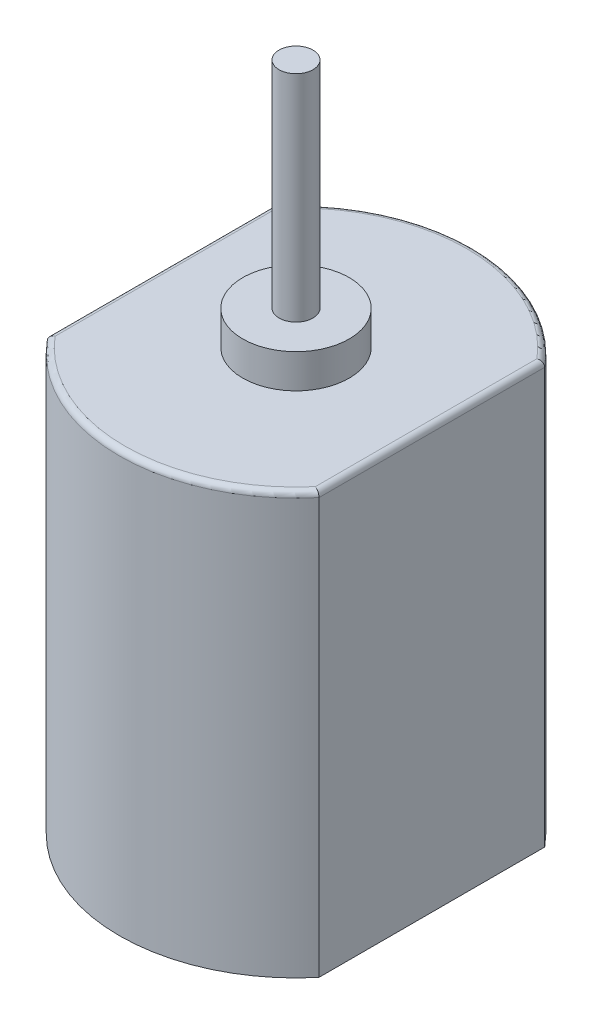
ISO-10303-21;
HEADER;
FILE_DESCRIPTION(('STEP AP214'),'2;1');
FILE_NAME('part.step','',(''),(''),'','','');
FILE_SCHEMA(('AUTOMOTIVE_DESIGN { 1 0 10303 214 1 1 1 1 }'));
ENDSEC;
DATA;
#1=APPLICATION_CONTEXT('core data for automotive mechanical design processes');
#2=APPLICATION_PROTOCOL_DEFINITION('international standard','automotive_design',2000,#1);
#3=PRODUCT_CONTEXT('',#1,'mechanical');
#4=PRODUCT('Part','Part','',(#3));
#5=PRODUCT_RELATED_PRODUCT_CATEGORY('part','',(#4));
#6=PRODUCT_DEFINITION_FORMATION('','',#4);
#7=PRODUCT_DEFINITION_CONTEXT('part definition',#1,'design');
#8=PRODUCT_DEFINITION('design','',#6,#7);
#9=PRODUCT_DEFINITION_SHAPE('','',#8);
#10=(LENGTH_UNIT() NAMED_UNIT(*) SI_UNIT(.MILLI.,.METRE.));
#11=(NAMED_UNIT(*) PLANE_ANGLE_UNIT() SI_UNIT($,.RADIAN.));
#12=(NAMED_UNIT(*) SI_UNIT($,.STERADIAN.) SOLID_ANGLE_UNIT());
#13=UNCERTAINTY_MEASURE_WITH_UNIT(LENGTH_MEASURE(1.E-05),#10,'distance_accuracy_value','');
#14=(GEOMETRIC_REPRESENTATION_CONTEXT(3) GLOBAL_UNCERTAINTY_ASSIGNED_CONTEXT((#13)) GLOBAL_UNIT_ASSIGNED_CONTEXT((#10,
#11,#12)) REPRESENTATION_CONTEXT('',''));
#15=CARTESIAN_POINT('',(0.,0.,0.));
#16=DIRECTION('',(0.,0.,1.));
#17=DIRECTION('',(1.,0.,0.));
#18=AXIS2_PLACEMENT_3D('',#15,#16,#17);
#19=CARTESIAN_POINT('',(0.,0.,0.));
#20=DIRECTION('',(0.,1.,0.));
#21=DIRECTION('',(0.,0.,1.));
#22=AXIS2_PLACEMENT_3D('',#19,#20,#21);
#23=PLANE('',#22);
#24=DIRECTION('',(-0.390731128489275,0.,0.92050485345244));
#25=VECTOR('',#24,1.);
#26=CARTESIAN_POINT('',(-0.506277669398839,0.,-0.2149021206691));
#27=LINE('',#26,#25);
#28=CARTESIAN_POINT('',(1.21293929595397,0.,-4.26512347585984));
#29=VERTEX_POINT('',#28);
#30=CARTESIAN_POINT('',(1.09571995740719,0.,-3.9889720198241));
#31=VERTEX_POINT('',#30);
#32=EDGE_CURVE('E189',#29,#31,#27,.T.);
#33=ORIENTED_EDGE('',*,*,#32,.F.);
#34=DIRECTION('',(0.92050485345244,0.,0.390731128489275));
#35=VECTOR('',#34,1.);
#36=CARTESIAN_POINT('',(1.71921696535281,0.,-4.05022135519074));
#37=LINE('',#36,#35);
#38=CARTESIAN_POINT('',(-0.167817984224689,0.,-4.85122016859375));
#39=VERTEX_POINT('',#38);
#40=EDGE_CURVE('E205',#39,#29,#37,.T.);
#41=ORIENTED_EDGE('',*,*,#40,.F.);
#42=DIRECTION('',(0.390731128489275,0.,-0.92050485345244));
#43=VECTOR('',#42,1.);
#44=CARTESIAN_POINT('',(-1.8870349495775,0.,-0.800998813403014));
#45=LINE('',#44,#43);
#46=CARTESIAN_POINT('',(-0.285037322771472,0.,-4.57506871255802));
#47=VERTEX_POINT('',#46);
#48=EDGE_CURVE('E218',#47,#39,#45,.T.);
#49=ORIENTED_EDGE('',*,*,#48,.F.);
#50=DIRECTION('',(-0.92050485345244,0.,-0.390731128489276));
#51=VECTOR('',#50,1.);
#52=CARTESIAN_POINT('',(1.60199762680603,0.,-3.774069899155));
#53=LINE('',#52,#51);
#54=EDGE_CURVE('E194',#31,#47,#53,.T.);
#55=ORIENTED_EDGE('',*,*,#54,.F.);
#56=EDGE_LOOP('',(#33,#41,#49,#55));
#57=FACE_BOUND('',#56,.T.);
#58=CARTESIAN_POINT('',(0.,0.,0.));
#59=DIRECTION('',(0.,1.,0.));
#60=DIRECTION('',(0.,0.,1.));
#61=AXIS2_PLACEMENT_3D('',#58,#59,#60);
#62=CIRCLE('',#61,7.8);
#63=CARTESIAN_POINT('',(6.,0.,-4.98397431775085));
#64=VERTEX_POINT('',#63);
#65=CARTESIAN_POINT('',(-6.,0.,-4.98397431775085));
#66=VERTEX_POINT('',#65);
#67=EDGE_CURVE('E240',#64,#66,#62,.T.);
#68=ORIENTED_EDGE('',*,*,#67,.F.);
#69=DIRECTION('',(0.,0.,-1.));
#70=VECTOR('',#69,1.);
#71=CARTESIAN_POINT('',(6.,0.,-4.98397431775085));
#72=LINE('',#71,#70);
#73=CARTESIAN_POINT('',(6.,0.,4.98397431775085));
#74=VERTEX_POINT('',#73);
#75=EDGE_CURVE('E252',#74,#64,#72,.T.);
#76=ORIENTED_EDGE('',*,*,#75,.F.);
#77=CARTESIAN_POINT('',(0.,0.,0.));
#78=DIRECTION('',(0.,1.,0.));
#79=DIRECTION('',(0.,0.,1.));
#80=AXIS2_PLACEMENT_3D('',#77,#78,#79);
#81=CIRCLE('',#80,7.8);
#82=CARTESIAN_POINT('',(-6.,0.,4.98397431775085));
#83=VERTEX_POINT('',#82);
#84=EDGE_CURVE('E248',#83,#74,#81,.T.);
#85=ORIENTED_EDGE('',*,*,#84,.F.);
#86=DIRECTION('',(0.,0.,1.));
#87=VECTOR('',#86,1.);
#88=CARTESIAN_POINT('',(-6.,0.,-4.98397431775085));
#89=LINE('',#88,#87);
#90=EDGE_CURVE('E244',#66,#83,#89,.T.);
#91=ORIENTED_EDGE('',*,*,#90,.F.);
#92=EDGE_LOOP('',(#68,#76,#85,#91));
#93=FACE_BOUND('',#92,.T.);
#94=DIRECTION('',(-0.390731128489273,0.,0.92050485345244));
#95=VECTOR('',#94,1.);
#96=CARTESIAN_POINT('',(1.8870349495775,0.,0.800998813403008));
#97=LINE('',#96,#95);
#98=CARTESIAN_POINT('',(0.285037322771475,0.,4.57506871255802));
#99=VERTEX_POINT('',#98);
#100=CARTESIAN_POINT('',(0.167817984224694,0.,4.85122016859375));
#101=VERTEX_POINT('',#100);
#102=EDGE_CURVE('E187',#99,#101,#97,.T.);
#103=ORIENTED_EDGE('',*,*,#102,.F.);
#104=DIRECTION('',(0.92050485345244,0.,0.390731128489275));
#105=VECTOR('',#104,1.);
#106=CARTESIAN_POINT('',(-1.60199762680603,0.,3.774069899155));
#107=LINE('',#106,#105);
#108=CARTESIAN_POINT('',(-1.09571995740718,0.,3.9889720198241));
#109=VERTEX_POINT('',#108);
#110=EDGE_CURVE('E184',#109,#99,#107,.T.);
#111=ORIENTED_EDGE('',*,*,#110,.F.);
#112=DIRECTION('',(0.390731128489275,0.,-0.92050485345244));
#113=VECTOR('',#112,1.);
#114=CARTESIAN_POINT('',(0.506277669398843,0.,0.214902120669102));
#115=LINE('',#114,#113);
#116=CARTESIAN_POINT('',(-1.21293929595397,0.,4.26512347585984));
#117=VERTEX_POINT('',#116);
#118=EDGE_CURVE('E589',#117,#109,#115,.T.);
#119=ORIENTED_EDGE('',*,*,#118,.F.);
#120=DIRECTION('',(-0.92050485345244,0.,-0.390731128489275));
#121=VECTOR('',#120,1.);
#122=CARTESIAN_POINT('',(-1.71921696535281,0.,4.05022135519074));
#123=LINE('',#122,#121);
#124=EDGE_CURVE('E586',#101,#117,#123,.T.);
#125=ORIENTED_EDGE('',*,*,#124,.F.);
#126=EDGE_LOOP('',(#103,#111,#119,#125));
#127=FACE_BOUND('',#126,.T.);
#128=ADVANCED_FACE('F53',(#57,#93,#127),#23,.F.);
#129=CARTESIAN_POINT('',(0.,18.6,0.));
#130=DIRECTION('',(0.,-1.,0.));
#131=DIRECTION('',(0.,0.,-1.));
#132=AXIS2_PLACEMENT_3D('',#129,#130,#131);
#133=CYLINDRICAL_SURFACE('',#132,7.8);
#134=DIRECTION('',(0.,-1.,0.));
#135=VECTOR('',#134,1.);
#136=CARTESIAN_POINT('',(-6.,18.6,-4.98397431775085));
#137=LINE('',#136,#135);
#138=CARTESIAN_POINT('',(-6.,18.35,-4.98397431775085));
#139=VERTEX_POINT('',#138);
#140=EDGE_CURVE('E265',#139,#66,#137,.T.);
#141=ORIENTED_EDGE('',*,*,#140,.F.);
#142=CARTESIAN_POINT('',(0.,18.35,0.));
#143=DIRECTION('',(0.,1.,0.));
#144=DIRECTION('',(0.,0.,1.));
#145=AXIS2_PLACEMENT_3D('',#142,#143,#144);
#146=CIRCLE('',#145,7.8);
#147=CARTESIAN_POINT('',(6.,18.35,-4.98397431775085));
#148=VERTEX_POINT('',#147);
#149=EDGE_CURVE('E11',#139,#148,#146,.F.);
#150=ORIENTED_EDGE('',*,*,#149,.T.);
#151=DIRECTION('',(0.,-1.,0.));
#152=VECTOR('',#151,1.);
#153=CARTESIAN_POINT('',(6.,18.6,-4.98397431775085));
#154=LINE('',#153,#152);
#155=EDGE_CURVE('E256',#148,#64,#154,.T.);
#156=ORIENTED_EDGE('',*,*,#155,.T.);
#157=ORIENTED_EDGE('',*,*,#67,.T.);
#158=EDGE_LOOP('',(#141,#150,#156,#157));
#159=FACE_BOUND('',#158,.T.);
#160=ADVANCED_FACE('F365',(#159),#133,.T.);
#161=CARTESIAN_POINT('',(-6.,18.6,-4.98397431775085));
#162=DIRECTION('',(1.,0.,0.));
#163=DIRECTION('',(0.,0.,-1.));
#164=AXIS2_PLACEMENT_3D('',#161,#162,#163);
#165=PLANE('',#164);
#166=DIRECTION('',(0.,-1.,0.));
#167=VECTOR('',#166,1.);
#168=CARTESIAN_POINT('',(-6.,18.6,4.98397431775085));
#169=LINE('',#168,#167);
#170=CARTESIAN_POINT('',(-6.,18.35,4.98397431775085));
#171=VERTEX_POINT('',#170);
#172=EDGE_CURVE('E262',#171,#83,#169,.T.);
#173=ORIENTED_EDGE('',*,*,#172,.F.);
#174=DIRECTION('',(0.,0.,1.));
#175=VECTOR('',#174,1.);
#176=CARTESIAN_POINT('',(-6.,18.35,-4.98397431775085));
#177=LINE('',#176,#175);
#178=EDGE_CURVE('E82',#171,#139,#177,.F.);
#179=ORIENTED_EDGE('',*,*,#178,.T.);
#180=ORIENTED_EDGE('',*,*,#140,.T.);
#181=ORIENTED_EDGE('',*,*,#90,.T.);
#182=EDGE_LOOP('',(#173,#179,#180,#181));
#183=FACE_BOUND('',#182,.T.);
#184=ADVANCED_FACE('F340',(#183),#165,.F.);
#185=CARTESIAN_POINT('',(0.,18.6,0.));
#186=DIRECTION('',(0.,-1.,0.));
#187=DIRECTION('',(0.,0.,-1.));
#188=AXIS2_PLACEMENT_3D('',#185,#186,#187);
#189=CYLINDRICAL_SURFACE('',#188,7.8);
#190=DIRECTION('',(0.,-1.,0.));
#191=VECTOR('',#190,1.);
#192=CARTESIAN_POINT('',(6.,18.6,4.98397431775085));
#193=LINE('',#192,#191);
#194=CARTESIAN_POINT('',(6.,18.35,4.98397431775085));
#195=VERTEX_POINT('',#194);
#196=EDGE_CURVE('E259',#195,#74,#193,.T.);
#197=ORIENTED_EDGE('',*,*,#196,.F.);
#198=CARTESIAN_POINT('',(0.,18.35,0.));
#199=DIRECTION('',(0.,1.,0.));
#200=DIRECTION('',(0.,0.,1.));
#201=AXIS2_PLACEMENT_3D('',#198,#199,#200);
#202=CIRCLE('',#201,7.8);
#203=EDGE_CURVE('E283',#195,#171,#202,.F.);
#204=ORIENTED_EDGE('',*,*,#203,.T.);
#205=ORIENTED_EDGE('',*,*,#172,.T.);
#206=ORIENTED_EDGE('',*,*,#84,.T.);
#207=EDGE_LOOP('',(#197,#204,#205,#206));
#208=FACE_BOUND('',#207,.T.);
#209=ADVANCED_FACE('F339',(#208),#189,.T.);
#210=CARTESIAN_POINT('',(6.,18.6,-4.98397431775085));
#211=DIRECTION('',(-1.,0.,0.));
#212=DIRECTION('',(0.,0.,1.));
#213=AXIS2_PLACEMENT_3D('',#210,#211,#212);
#214=PLANE('',#213);
#215=ORIENTED_EDGE('',*,*,#155,.F.);
#216=DIRECTION('',(0.,0.,-1.));
#217=VECTOR('',#216,1.);
#218=CARTESIAN_POINT('',(6.,18.35,4.98397431775085));
#219=LINE('',#218,#217);
#220=EDGE_CURVE('E68',#148,#195,#219,.F.);
#221=ORIENTED_EDGE('',*,*,#220,.T.);
#222=ORIENTED_EDGE('',*,*,#196,.T.);
#223=ORIENTED_EDGE('',*,*,#75,.T.);
#224=EDGE_LOOP('',(#215,#221,#222,#223));
#225=FACE_BOUND('',#224,.T.);
#226=ADVANCED_FACE('F348',(#225),#214,.F.);
#227=CARTESIAN_POINT('',(0.,18.6,0.));
#228=DIRECTION('',(0.,1.,0.));
#229=DIRECTION('',(0.,0.,1.));
#230=AXIS2_PLACEMENT_3D('',#227,#228,#229);
#231=PLANE('',#230);
#232=DIRECTION('',(0.,0.,1.));
#233=VECTOR('',#232,1.);
#234=CARTESIAN_POINT('',(-5.75,18.6,4.98397431775085));
#235=LINE('',#234,#233);
#236=CARTESIAN_POINT('',(-5.75,18.6,-4.89285192909003));
#237=VERTEX_POINT('',#236);
#238=CARTESIAN_POINT('',(-5.75,18.6,4.89285192909003));
#239=VERTEX_POINT('',#238);
#240=EDGE_CURVE('E276',#237,#239,#235,.T.);
#241=ORIENTED_EDGE('',*,*,#240,.T.);
#242=CARTESIAN_POINT('',(0.,18.6,0.));
#243=DIRECTION('',(0.,1.,0.));
#244=DIRECTION('',(0.,0.,1.));
#245=AXIS2_PLACEMENT_3D('',#242,#243,#244);
#246=CIRCLE('',#245,7.55);
#247=CARTESIAN_POINT('',(5.75,18.6,4.89285192909003));
#248=VERTEX_POINT('',#247);
#249=EDGE_CURVE('E279',#239,#248,#246,.T.);
#250=ORIENTED_EDGE('',*,*,#249,.T.);
#251=DIRECTION('',(0.,0.,-1.));
#252=VECTOR('',#251,1.);
#253=CARTESIAN_POINT('',(5.75,18.6,-4.98397431775085));
#254=LINE('',#253,#252);
#255=CARTESIAN_POINT('',(5.75,18.6,-4.89285192909003));
#256=VERTEX_POINT('',#255);
#257=EDGE_CURVE('E272',#248,#256,#254,.T.);
#258=ORIENTED_EDGE('',*,*,#257,.T.);
#259=CARTESIAN_POINT('',(0.,18.6,0.));
#260=DIRECTION('',(0.,1.,0.));
#261=DIRECTION('',(0.,0.,1.));
#262=AXIS2_PLACEMENT_3D('',#259,#260,#261);
#263=CIRCLE('',#262,7.55);
#264=EDGE_CURVE('E269',#256,#237,#263,.T.);
#265=ORIENTED_EDGE('',*,*,#264,.T.);
#266=EDGE_LOOP('',(#241,#250,#258,#265));
#267=FACE_BOUND('',#266,.T.);
#268=CARTESIAN_POINT('',(0.,18.6,0.));
#269=DIRECTION('',(0.,1.,0.));
#270=DIRECTION('',(0.,0.,1.));
#271=AXIS2_PLACEMENT_3D('',#268,#269,#270);
#272=CIRCLE('',#271,2.35);
#273=CARTESIAN_POINT('',(0.,18.6,2.35));
#274=VERTEX_POINT('',#273);
#275=EDGE_CURVE('E268',#274,#274,#272,.T.);
#276=ORIENTED_EDGE('',*,*,#275,.F.);
#277=EDGE_LOOP('',(#276));
#278=FACE_BOUND('',#277,.T.);
#279=ADVANCED_FACE('F351',(#267,#278),#231,.T.);
#280=CARTESIAN_POINT('',(-0.506277669398839,-2.2,-0.2149021206691));
#281=DIRECTION('',(-0.92050485345244,0.,-0.390731128489275));
#282=DIRECTION('',(-0.390731128489275,0.,0.92050485345244));
#283=AXIS2_PLACEMENT_3D('',#280,#281,#282);
#284=PLANE('',#283);
#285=ORIENTED_EDGE('',*,*,#32,.T.);
#286=DIRECTION('',(0.,1.,0.));
#287=VECTOR('',#286,1.);
#288=CARTESIAN_POINT('',(1.09571995740719,-2.2,-3.9889720198241));
#289=LINE('',#288,#287);
#290=CARTESIAN_POINT('',(1.09571995740719,-2.2,-3.9889720198241));
#291=VERTEX_POINT('',#290);
#292=EDGE_CURVE('E236',#291,#31,#289,.T.);
#293=ORIENTED_EDGE('',*,*,#292,.F.);
#294=DIRECTION('',(-0.390731128489275,0.,0.92050485345244));
#295=VECTOR('',#294,1.);
#296=CARTESIAN_POINT('',(-0.506277669398839,-2.2,-0.2149021206691));
#297=LINE('',#296,#295);
#298=CARTESIAN_POINT('',(1.21293929595397,-2.2,-4.26512347585984));
#299=VERTEX_POINT('',#298);
#300=EDGE_CURVE('E200',#299,#291,#297,.T.);
#301=ORIENTED_EDGE('',*,*,#300,.F.);
#302=DIRECTION('',(0.,1.,0.));
#303=VECTOR('',#302,1.);
#304=CARTESIAN_POINT('',(1.21293929595397,-2.2,-4.26512347585984));
#305=LINE('',#304,#303);
#306=EDGE_CURVE('E213',#299,#29,#305,.T.);
#307=ORIENTED_EDGE('',*,*,#306,.T.);
#308=EDGE_LOOP('',(#285,#293,#301,#307));
#309=FACE_BOUND('',#308,.T.);
#310=ADVANCED_FACE('F399',(#309),#284,.F.);
#311=CARTESIAN_POINT('',(1.60199762680603,-2.2,-3.774069899155));
#312=DIRECTION('',(0.390731128489276,0.,-0.92050485345244));
#313=DIRECTION('',(-0.92050485345244,0.,-0.390731128489276));
#314=AXIS2_PLACEMENT_3D('',#311,#312,#313);
#315=PLANE('',#314);
#316=ORIENTED_EDGE('',*,*,#54,.T.);
#317=DIRECTION('',(0.,1.,0.));
#318=VECTOR('',#317,1.);
#319=CARTESIAN_POINT('',(-0.285037322771472,-2.2,-4.57506871255802));
#320=LINE('',#319,#318);
#321=CARTESIAN_POINT('',(-0.285037322771472,-2.2,-4.57506871255802));
#322=VERTEX_POINT('',#321);
#323=EDGE_CURVE('E232',#322,#47,#320,.T.);
#324=ORIENTED_EDGE('',*,*,#323,.F.);
#325=DIRECTION('',(-0.92050485345244,0.,-0.390731128489276));
#326=VECTOR('',#325,1.);
#327=CARTESIAN_POINT('',(1.60199762680603,-2.2,-3.774069899155));
#328=LINE('',#327,#326);
#329=EDGE_CURVE('E204',#291,#322,#328,.T.);
#330=ORIENTED_EDGE('',*,*,#329,.F.);
#331=ORIENTED_EDGE('',*,*,#292,.T.);
#332=EDGE_LOOP('',(#316,#324,#330,#331));
#333=FACE_BOUND('',#332,.T.);
#334=ADVANCED_FACE('F413',(#333),#315,.F.);
#335=CARTESIAN_POINT('',(-1.8870349495775,-2.2,-0.800998813403014));
#336=DIRECTION('',(0.92050485345244,0.,0.390731128489275));
#337=DIRECTION('',(0.390731128489275,0.,-0.92050485345244));
#338=AXIS2_PLACEMENT_3D('',#335,#336,#337);
#339=PLANE('',#338);
#340=ORIENTED_EDGE('',*,*,#48,.T.);
#341=DIRECTION('',(0.,1.,0.));
#342=VECTOR('',#341,1.);
#343=CARTESIAN_POINT('',(-0.167817984224689,-2.2,-4.85122016859375));
#344=LINE('',#343,#342);
#345=CARTESIAN_POINT('',(-0.167817984224689,-2.2,-4.85122016859375));
#346=VERTEX_POINT('',#345);
#347=EDGE_CURVE('E228',#346,#39,#344,.T.);
#348=ORIENTED_EDGE('',*,*,#347,.F.);
#349=DIRECTION('',(0.390731128489275,0.,-0.92050485345244));
#350=VECTOR('',#349,1.);
#351=CARTESIAN_POINT('',(-1.8870349495775,-2.2,-0.800998813403014));
#352=LINE('',#351,#350);
#353=EDGE_CURVE('E208',#322,#346,#352,.T.);
#354=ORIENTED_EDGE('',*,*,#353,.F.);
#355=ORIENTED_EDGE('',*,*,#323,.T.);
#356=EDGE_LOOP('',(#340,#348,#354,#355));
#357=FACE_BOUND('',#356,.T.);
#358=ADVANCED_FACE('F422',(#357),#339,.F.);
#359=CARTESIAN_POINT('',(1.71921696535281,-2.2,-4.05022135519074));
#360=DIRECTION('',(-0.390731128489275,0.,0.92050485345244));
#361=DIRECTION('',(0.92050485345244,0.,0.390731128489275));
#362=AXIS2_PLACEMENT_3D('',#359,#360,#361);
#363=PLANE('',#362);
#364=ORIENTED_EDGE('',*,*,#40,.T.);
#365=ORIENTED_EDGE('',*,*,#306,.F.);
#366=DIRECTION('',(0.92050485345244,0.,0.390731128489275));
#367=VECTOR('',#366,1.);
#368=CARTESIAN_POINT('',(1.71921696535281,-2.2,-4.05022135519074));
#369=LINE('',#368,#367);
#370=EDGE_CURVE('E211',#346,#299,#369,.T.);
#371=ORIENTED_EDGE('',*,*,#370,.F.);
#372=ORIENTED_EDGE('',*,*,#347,.T.);
#373=EDGE_LOOP('',(#364,#365,#371,#372));
#374=FACE_BOUND('',#373,.T.);
#375=ADVANCED_FACE('F432',(#374),#363,.F.);
#376=CARTESIAN_POINT('',(0.,-2.2,0.));
#377=DIRECTION('',(0.,-1.,0.));
#378=DIRECTION('',(0.,0.,-1.));
#379=AXIS2_PLACEMENT_3D('',#376,#377,#378);
#380=PLANE('',#379);
#381=ORIENTED_EDGE('',*,*,#300,.T.);
#382=ORIENTED_EDGE('',*,*,#329,.T.);
#383=ORIENTED_EDGE('',*,*,#353,.T.);
#384=ORIENTED_EDGE('',*,*,#370,.T.);
#385=EDGE_LOOP('',(#381,#382,#383,#384));
#386=FACE_BOUND('',#385,.T.);
#387=ADVANCED_FACE('F442',(#386),#380,.T.);
#388=CARTESIAN_POINT('',(1.8870349495775,-2.2,0.800998813403008));
#389=DIRECTION('',(-0.92050485345244,0.,-0.390731128489273));
#390=DIRECTION('',(-0.390731128489273,0.,0.92050485345244));
#391=AXIS2_PLACEMENT_3D('',#388,#389,#390);
#392=PLANE('',#391);
#393=ORIENTED_EDGE('',*,*,#102,.T.);
#394=DIRECTION('',(0.,1.,0.));
#395=VECTOR('',#394,1.);
#396=CARTESIAN_POINT('',(0.167817984224694,-2.2,4.85122016859375));
#397=LINE('',#396,#395);
#398=CARTESIAN_POINT('',(0.167817984224694,-2.2,4.85122016859375));
#399=VERTEX_POINT('',#398);
#400=EDGE_CURVE('E166',#399,#101,#397,.T.);
#401=ORIENTED_EDGE('',*,*,#400,.F.);
#402=DIRECTION('',(-0.390731128489273,0.,0.92050485345244));
#403=VECTOR('',#402,1.);
#404=CARTESIAN_POINT('',(1.8870349495775,-2.2,0.800998813403008));
#405=LINE('',#404,#403);
#406=CARTESIAN_POINT('',(0.285037322771475,-2.2,4.57506871255802));
#407=VERTEX_POINT('',#406);
#408=EDGE_CURVE('E174',#407,#399,#405,.T.);
#409=ORIENTED_EDGE('',*,*,#408,.F.);
#410=DIRECTION('',(0.,1.,0.));
#411=VECTOR('',#410,1.);
#412=CARTESIAN_POINT('',(0.285037322771475,-2.2,4.57506871255802));
#413=LINE('',#412,#411);
#414=EDGE_CURVE('E583',#407,#99,#413,.T.);
#415=ORIENTED_EDGE('',*,*,#414,.T.);
#416=EDGE_LOOP('',(#393,#401,#409,#415));
#417=FACE_BOUND('',#416,.T.);
#418=ADVANCED_FACE('F186',(#417),#392,.F.);
#419=CARTESIAN_POINT('',(-1.71921696535281,-2.2,4.05022135519074));
#420=DIRECTION('',(0.390731128489275,0.,-0.92050485345244));
#421=DIRECTION('',(-0.92050485345244,0.,-0.390731128489275));
#422=AXIS2_PLACEMENT_3D('',#419,#420,#421);
#423=PLANE('',#422);
#424=ORIENTED_EDGE('',*,*,#124,.T.);
#425=DIRECTION('',(0.,1.,0.));
#426=VECTOR('',#425,1.);
#427=CARTESIAN_POINT('',(-1.21293929595397,-2.2,4.26512347585984));
#428=LINE('',#427,#426);
#429=CARTESIAN_POINT('',(-1.21293929595397,-2.2,4.26512347585984));
#430=VERTEX_POINT('',#429);
#431=EDGE_CURVE('E169',#430,#117,#428,.T.);
#432=ORIENTED_EDGE('',*,*,#431,.F.);
#433=DIRECTION('',(-0.92050485345244,0.,-0.390731128489275));
#434=VECTOR('',#433,1.);
#435=CARTESIAN_POINT('',(-1.71921696535281,-2.2,4.05022135519074));
#436=LINE('',#435,#434);
#437=EDGE_CURVE('E161',#399,#430,#436,.T.);
#438=ORIENTED_EDGE('',*,*,#437,.F.);
#439=ORIENTED_EDGE('',*,*,#400,.T.);
#440=EDGE_LOOP('',(#424,#432,#438,#439));
#441=FACE_BOUND('',#440,.T.);
#442=ADVANCED_FACE('F164',(#441),#423,.F.);
#443=CARTESIAN_POINT('',(0.506277669398843,-2.2,0.214902120669102));
#444=DIRECTION('',(0.92050485345244,0.,0.390731128489275));
#445=DIRECTION('',(0.390731128489275,0.,-0.92050485345244));
#446=AXIS2_PLACEMENT_3D('',#443,#444,#445);
#447=PLANE('',#446);
#448=ORIENTED_EDGE('',*,*,#118,.T.);
#449=DIRECTION('',(0.,1.,0.));
#450=VECTOR('',#449,1.);
#451=CARTESIAN_POINT('',(-1.09571995740718,-2.2,3.9889720198241));
#452=LINE('',#451,#450);
#453=CARTESIAN_POINT('',(-1.09571995740718,-2.2,3.9889720198241));
#454=VERTEX_POINT('',#453);
#455=EDGE_CURVE('E196',#454,#109,#452,.T.);
#456=ORIENTED_EDGE('',*,*,#455,.F.);
#457=DIRECTION('',(0.390731128489275,0.,-0.92050485345244));
#458=VECTOR('',#457,1.);
#459=CARTESIAN_POINT('',(0.506277669398843,-2.2,0.214902120669102));
#460=LINE('',#459,#458);
#461=EDGE_CURVE('E173',#430,#454,#460,.T.);
#462=ORIENTED_EDGE('',*,*,#461,.F.);
#463=ORIENTED_EDGE('',*,*,#431,.T.);
#464=EDGE_LOOP('',(#448,#456,#462,#463));
#465=FACE_BOUND('',#464,.T.);
#466=ADVANCED_FACE('F469',(#465),#447,.F.);
#467=CARTESIAN_POINT('',(-1.60199762680603,-2.2,3.774069899155));
#468=DIRECTION('',(-0.390731128489275,0.,0.92050485345244));
#469=DIRECTION('',(0.92050485345244,0.,0.390731128489275));
#470=AXIS2_PLACEMENT_3D('',#467,#468,#469);
#471=PLANE('',#470);
#472=ORIENTED_EDGE('',*,*,#110,.T.);
#473=ORIENTED_EDGE('',*,*,#414,.F.);
#474=DIRECTION('',(0.92050485345244,0.,0.390731128489275));
#475=VECTOR('',#474,1.);
#476=CARTESIAN_POINT('',(-1.60199762680603,-2.2,3.774069899155));
#477=LINE('',#476,#475);
#478=EDGE_CURVE('E179',#454,#407,#477,.T.);
#479=ORIENTED_EDGE('',*,*,#478,.F.);
#480=ORIENTED_EDGE('',*,*,#455,.T.);
#481=EDGE_LOOP('',(#472,#473,#479,#480));
#482=FACE_BOUND('',#481,.T.);
#483=ADVANCED_FACE('F478',(#482),#471,.F.);
#484=CARTESIAN_POINT('',(0.,-2.2,0.));
#485=DIRECTION('',(0.,-1.,0.));
#486=DIRECTION('',(0.,0.,-1.));
#487=AXIS2_PLACEMENT_3D('',#484,#485,#486);
#488=PLANE('',#487);
#489=ORIENTED_EDGE('',*,*,#408,.T.);
#490=ORIENTED_EDGE('',*,*,#437,.T.);
#491=ORIENTED_EDGE('',*,*,#461,.T.);
#492=ORIENTED_EDGE('',*,*,#478,.T.);
#493=EDGE_LOOP('',(#489,#490,#491,#492));
#494=FACE_BOUND('',#493,.T.);
#495=ADVANCED_FACE('F177',(#494),#488,.T.);
#496=CARTESIAN_POINT('',(0.,20.1,0.));
#497=DIRECTION('',(0.,-1.,0.));
#498=DIRECTION('',(0.,0.,-1.));
#499=AXIS2_PLACEMENT_3D('',#496,#497,#498);
#500=CYLINDRICAL_SURFACE('',#499,2.35);
#501=CARTESIAN_POINT('',(0.,20.1,0.));
#502=DIRECTION('',(0.,1.,0.));
#503=DIRECTION('',(0.,0.,1.));
#504=AXIS2_PLACEMENT_3D('',#501,#502,#503);
#505=CIRCLE('',#504,2.35);
#506=CARTESIAN_POINT('',(0.,20.1,2.35));
#507=VERTEX_POINT('',#506);
#508=EDGE_CURVE('E575',#507,#507,#505,.T.);
#509=ORIENTED_EDGE('',*,*,#508,.F.);
#510=EDGE_LOOP('',(#509));
#511=FACE_BOUND('',#510,.T.);
#512=ORIENTED_EDGE('',*,*,#275,.T.);
#513=EDGE_LOOP('',(#512));
#514=FACE_BOUND('',#513,.T.);
#515=ADVANCED_FACE('F497',(#511,#514),#500,.T.);
#516=CARTESIAN_POINT('',(0.,20.1,0.));
#517=DIRECTION('',(0.,1.,0.));
#518=DIRECTION('',(0.,0.,1.));
#519=AXIS2_PLACEMENT_3D('',#516,#517,#518);
#520=PLANE('',#519);
#521=CARTESIAN_POINT('',(0.,20.1,0.));
#522=DIRECTION('',(0.,1.,0.));
#523=DIRECTION('',(0.,0.,1.));
#524=AXIS2_PLACEMENT_3D('',#521,#522,#523);
#525=CIRCLE('',#524,0.75);
#526=CARTESIAN_POINT('',(0.,20.1,0.75));
#527=VERTEX_POINT('',#526);
#528=EDGE_CURVE('E273',#527,#527,#525,.T.);
#529=ORIENTED_EDGE('',*,*,#528,.F.);
#530=EDGE_LOOP('',(#529));
#531=FACE_BOUND('',#530,.T.);
#532=ORIENTED_EDGE('',*,*,#508,.T.);
#533=EDGE_LOOP('',(#532));
#534=FACE_BOUND('',#533,.T.);
#535=ADVANCED_FACE('F506',(#531,#534),#520,.T.);
#536=CARTESIAN_POINT('',(0.,29.6,0.));
#537=DIRECTION('',(0.,-1.,0.));
#538=DIRECTION('',(0.,0.,-1.));
#539=AXIS2_PLACEMENT_3D('',#536,#537,#538);
#540=CYLINDRICAL_SURFACE('',#539,0.75);
#541=CARTESIAN_POINT('',(0.,29.6,0.));
#542=DIRECTION('',(0.,1.,0.));
#543=DIRECTION('',(0.,0.,1.));
#544=AXIS2_PLACEMENT_3D('',#541,#542,#543);
#545=CIRCLE('',#544,0.75);
#546=CARTESIAN_POINT('',(0.,29.6,0.75));
#547=VERTEX_POINT('',#546);
#548=EDGE_CURVE('E328',#547,#547,#545,.T.);
#549=ORIENTED_EDGE('',*,*,#548,.F.);
#550=EDGE_LOOP('',(#549));
#551=FACE_BOUND('',#550,.T.);
#552=ORIENTED_EDGE('',*,*,#528,.T.);
#553=EDGE_LOOP('',(#552));
#554=FACE_BOUND('',#553,.T.);
#555=ADVANCED_FACE('F361',(#551,#554),#540,.T.);
#556=CARTESIAN_POINT('',(0.,29.6,0.));
#557=DIRECTION('',(0.,1.,0.));
#558=DIRECTION('',(0.,0.,1.));
#559=AXIS2_PLACEMENT_3D('',#556,#557,#558);
#560=PLANE('',#559);
#561=ORIENTED_EDGE('',*,*,#548,.T.);
#562=EDGE_LOOP('',(#561));
#563=FACE_BOUND('',#562,.T.);
#564=ADVANCED_FACE('F355',(#563),#560,.T.);
#565=CARTESIAN_POINT('',(0.,18.35,0.));
#566=DIRECTION('',(0.,1.,0.));
#567=DIRECTION('',(0.,0.,1.));
#568=AXIS2_PLACEMENT_3D('',#565,#566,#567);
#569=TOROIDAL_SURFACE('',#568,7.55,0.25);
#570=CARTESIAN_POINT('',(6.,18.35,-4.98397431775085));
#571=CARTESIAN_POINT('',(6.00001440234204,18.3634595164735,-4.98397933875729));
#572=CARTESIAN_POINT('',(5.99891402822755,18.376910663013,-4.98358210924978));
#573=CARTESIAN_POINT('',(5.99459539272456,18.4033916517252,-4.98202212895655));
#574=CARTESIAN_POINT('',(5.99138211753959,18.4164224102006,-4.98086118045703));
#575=CARTESIAN_POINT('',(5.9829488174727,18.4417236108655,-4.97781256317563));
#576=CARTESIAN_POINT('',(5.97772899091008,18.4539941280551,-4.97592496621269));
#577=CARTESIAN_POINT('',(5.96547328120277,18.4774615825668,-4.97148959033694));
#578=CARTESIAN_POINT('',(5.95843696730385,18.4886582643791,-4.96894165483363));
#579=CARTESIAN_POINT('',(5.94258648027432,18.5099724449911,-4.96319652512237));
#580=CARTESIAN_POINT('',(5.93373287949436,18.5200566765456,-4.95998491920639));
#581=CARTESIAN_POINT('',(5.91463720090976,18.5386051239675,-4.9530501649092));
#582=CARTESIAN_POINT('',(5.90439463858643,18.5470687720223,-4.94932683801554));
#583=CARTESIAN_POINT('',(5.88220078352461,18.5626428589957,-4.94124883208922));
#584=CARTESIAN_POINT('',(5.87018565729043,18.569649877753,-4.93687037239927));
#585=CARTESIAN_POINT('',(5.84526814692468,18.5815481477806,-4.92777698015875));
#586=CARTESIAN_POINT('',(5.83236572472884,18.5864393082165,-4.92306203317282));
#587=CARTESIAN_POINT('',(5.80851021737343,18.5933112360723,-4.91433129980003));
#588=CARTESIAN_POINT('',(5.79764948303536,18.5956673100437,-4.91035175328465));
#589=CARTESIAN_POINT('',(5.77575362123663,18.5989153274979,-4.90231874719358));
#590=CARTESIAN_POINT('',(5.7647188489943,18.5998099404604,-4.898265436085));
#591=CARTESIAN_POINT('',(5.75245771694291,18.5999909592572,-4.89375602062279));
#592=CARTESIAN_POINT('',(5.75122877347807,18.6000000226504,-4.89330397521584));
#593=CARTESIAN_POINT('',(5.75,18.6,-4.89285192909003));
#594=B_SPLINE_CURVE_WITH_KNOTS('',3,(#570,#571,#572,#573,#574,#575,#576,#577,#578,#579,#580,
#581,#582,#583,#584,#585,#586,#587,#588,#589,#590,#591,#592,#593),.UNSPECIFIED.,.F.,.F.,(4,2,2,
2,2,2,2,2,2,2,2,4),(0.,0.0403149085006315,0.0805350182593929,0.120751153849275,
0.160976834900182,0.202190674555931,0.243418928211471,0.286975609969632,0.330534161440772,
0.365861811804857,0.401124860842376,0.405053144491276),.UNSPECIFIED.);
#595=EDGE_CURVE('E315',#148,#256,#594,.T.);
#596=ORIENTED_EDGE('',*,*,#595,.F.);
#597=ORIENTED_EDGE('',*,*,#149,.F.);
#598=CARTESIAN_POINT('',(-6.,18.35,-4.98397431775085));
#599=CARTESIAN_POINT('',(-6.00001440234204,18.3634595164735,-4.98397933875729));
#600=CARTESIAN_POINT('',(-5.99891402822755,18.376910663013,-4.98358210924978));
#601=CARTESIAN_POINT('',(-5.99459539272456,18.4033916517252,-4.98202212895655));
#602=CARTESIAN_POINT('',(-5.99138211753959,18.4164224102006,-4.98086118045703));
#603=CARTESIAN_POINT('',(-5.9829488174727,18.4417236108655,-4.97781256317563));
#604=CARTESIAN_POINT('',(-5.97772899091008,18.4539941280551,-4.97592496621269));
#605=CARTESIAN_POINT('',(-5.96547328120277,18.4774615825668,-4.97148959033694));
#606=CARTESIAN_POINT('',(-5.95843696730385,18.4886582643791,-4.96894165483363));
#607=CARTESIAN_POINT('',(-5.94258648027432,18.5099724449911,-4.96319652512237));
#608=CARTESIAN_POINT('',(-5.93373287949436,18.5200566765456,-4.95998491920639));
#609=CARTESIAN_POINT('',(-5.91463720090976,18.5386051239675,-4.9530501649092));
#610=CARTESIAN_POINT('',(-5.90439463858643,18.5470687720223,-4.94932683801554));
#611=CARTESIAN_POINT('',(-5.88220078352461,18.5626428589957,-4.94124883208922));
#612=CARTESIAN_POINT('',(-5.87018565729043,18.569649877753,-4.93687037239927));
#613=CARTESIAN_POINT('',(-5.84526814692468,18.5815481477806,-4.92777698015875));
#614=CARTESIAN_POINT('',(-5.83236572472884,18.5864393082165,-4.92306203317282));
#615=CARTESIAN_POINT('',(-5.80851021737343,18.5933112360723,-4.91433129980003));
#616=CARTESIAN_POINT('',(-5.79764948303536,18.5956673100437,-4.91035175328465));
#617=CARTESIAN_POINT('',(-5.77575362123663,18.5989153274979,-4.90231874719358));
#618=CARTESIAN_POINT('',(-5.7647188489943,18.5998099404604,-4.898265436085));
#619=CARTESIAN_POINT('',(-5.75245771694291,18.5999909592572,-4.89375602062279));
#620=CARTESIAN_POINT('',(-5.75122877347807,18.6000000226504,-4.89330397521584));
#621=CARTESIAN_POINT('',(-5.75,18.6,-4.89285192909003));
#622=B_SPLINE_CURVE_WITH_KNOTS('',3,(#598,#599,#600,#601,#602,#603,#604,#605,#606,#607,#608,
#609,#610,#611,#612,#613,#614,#615,#616,#617,#618,#619,#620,#621),.UNSPECIFIED.,.F.,.F.,(4,2,2,
2,2,2,2,2,2,2,2,4),(0.,0.0403149085006315,0.0805350182593929,0.120751153849275,
0.160976834900182,0.202190674555931,0.243418928211471,0.286975609969632,0.330534161440772,
0.365861811804857,0.401124860842376,0.405053144491276),.UNSPECIFIED.);
#623=EDGE_CURVE('E58',#237,#139,#622,.F.);
#624=ORIENTED_EDGE('',*,*,#623,.F.);
#625=ORIENTED_EDGE('',*,*,#264,.F.);
#626=EDGE_LOOP('',(#596,#597,#624,#625));
#627=FACE_BOUND('',#626,.T.);
#628=ADVANCED_FACE('F55',(#627),#569,.T.);
#629=CARTESIAN_POINT('',(-5.75,18.35,0.));
#630=DIRECTION('',(0.,0.,-1.));
#631=DIRECTION('',(-1.,0.,0.));
#632=AXIS2_PLACEMENT_3D('',#629,#630,#631);
#633=CYLINDRICAL_SURFACE('',#632,0.25);
#634=ORIENTED_EDGE('',*,*,#623,.T.);
#635=ORIENTED_EDGE('',*,*,#178,.F.);
#636=CARTESIAN_POINT('',(-6.,18.35,4.98397431775085));
#637=CARTESIAN_POINT('',(-6.00001440234204,18.3634595164735,4.98397933875729));
#638=CARTESIAN_POINT('',(-5.99891402822755,18.376910663013,4.98358210924978));
#639=CARTESIAN_POINT('',(-5.99459539272456,18.4033916517252,4.98202212895655));
#640=CARTESIAN_POINT('',(-5.99138211753959,18.4164224102006,4.98086118045703));
#641=CARTESIAN_POINT('',(-5.9829488174727,18.4417236108655,4.97781256317563));
#642=CARTESIAN_POINT('',(-5.97772899091008,18.4539941280551,4.97592496621269));
#643=CARTESIAN_POINT('',(-5.96547328120277,18.4774615825668,4.97148959033694));
#644=CARTESIAN_POINT('',(-5.95843696730385,18.4886582643791,4.96894165483363));
#645=CARTESIAN_POINT('',(-5.94258648027432,18.5099724449911,4.96319652512237));
#646=CARTESIAN_POINT('',(-5.93373287949436,18.5200566765456,4.95998491920639));
#647=CARTESIAN_POINT('',(-5.91463720090976,18.5386051239675,4.9530501649092));
#648=CARTESIAN_POINT('',(-5.90439463858643,18.5470687720223,4.94932683801554));
#649=CARTESIAN_POINT('',(-5.88220078352461,18.5626428589957,4.94124883208922));
#650=CARTESIAN_POINT('',(-5.87018565729043,18.569649877753,4.93687037239927));
#651=CARTESIAN_POINT('',(-5.84526814692468,18.5815481477806,4.92777698015875));
#652=CARTESIAN_POINT('',(-5.83236572472884,18.5864393082165,4.92306203317282));
#653=CARTESIAN_POINT('',(-5.80851021737343,18.5933112360723,4.91433129980003));
#654=CARTESIAN_POINT('',(-5.79764948303536,18.5956673100437,4.91035175328465));
#655=CARTESIAN_POINT('',(-5.77575362123663,18.5989153274979,4.90231874719358));
#656=CARTESIAN_POINT('',(-5.7647188489943,18.5998099404604,4.898265436085));
#657=CARTESIAN_POINT('',(-5.75245771694291,18.5999909592572,4.89375602062279));
#658=CARTESIAN_POINT('',(-5.75122877347807,18.6000000226504,4.89330397521584));
#659=CARTESIAN_POINT('',(-5.75,18.6,4.89285192909003));
#660=B_SPLINE_CURVE_WITH_KNOTS('',3,(#636,#637,#638,#639,#640,#641,#642,#643,#644,#645,#646,
#647,#648,#649,#650,#651,#652,#653,#654,#655,#656,#657,#658,#659),.UNSPECIFIED.,.F.,.F.,(4,2,2,
2,2,2,2,2,2,2,2,4),(0.,0.0403149085006315,0.0805350182593929,0.120751153849275,
0.160976834900182,0.202190674555931,0.243418928211471,0.286975609969632,0.330534161440772,
0.365861811804858,0.401124860842375,0.405053144491275),.UNSPECIFIED.);
#661=EDGE_CURVE('E300',#239,#171,#660,.F.);
#662=ORIENTED_EDGE('',*,*,#661,.F.);
#663=ORIENTED_EDGE('',*,*,#240,.F.);
#664=EDGE_LOOP('',(#634,#635,#662,#663));
#665=FACE_BOUND('',#664,.T.);
#666=ADVANCED_FACE('F311',(#665),#633,.T.);
#667=CARTESIAN_POINT('',(5.75,18.35,0.));
#668=DIRECTION('',(0.,0.,1.));
#669=DIRECTION('',(1.,0.,0.));
#670=AXIS2_PLACEMENT_3D('',#667,#668,#669);
#671=CYLINDRICAL_SURFACE('',#670,0.25);
#672=ORIENTED_EDGE('',*,*,#595,.T.);
#673=ORIENTED_EDGE('',*,*,#257,.F.);
#674=CARTESIAN_POINT('',(6.,18.35,4.98397431775085));
#675=CARTESIAN_POINT('',(6.00001440234204,18.3634595164735,4.98397933875729));
#676=CARTESIAN_POINT('',(5.99891402822755,18.376910663013,4.98358210924978));
#677=CARTESIAN_POINT('',(5.99459539272456,18.4033916517252,4.98202212895655));
#678=CARTESIAN_POINT('',(5.99138211753959,18.4164224102006,4.98086118045703));
#679=CARTESIAN_POINT('',(5.9829488174727,18.4417236108655,4.97781256317563));
#680=CARTESIAN_POINT('',(5.97772899091008,18.4539941280551,4.97592496621269));
#681=CARTESIAN_POINT('',(5.96547328120277,18.4774615825668,4.97148959033694));
#682=CARTESIAN_POINT('',(5.95843696730385,18.4886582643791,4.96894165483363));
#683=CARTESIAN_POINT('',(5.94258648027432,18.5099724449911,4.96319652512237));
#684=CARTESIAN_POINT('',(5.93373287949436,18.5200566765456,4.95998491920639));
#685=CARTESIAN_POINT('',(5.91463720090976,18.5386051239675,4.9530501649092));
#686=CARTESIAN_POINT('',(5.90439463858643,18.5470687720223,4.94932683801554));
#687=CARTESIAN_POINT('',(5.88220078352461,18.5626428589957,4.94124883208922));
#688=CARTESIAN_POINT('',(5.87018565729043,18.569649877753,4.93687037239927));
#689=CARTESIAN_POINT('',(5.84526814692468,18.5815481477806,4.92777698015875));
#690=CARTESIAN_POINT('',(5.83236572472884,18.5864393082165,4.92306203317282));
#691=CARTESIAN_POINT('',(5.80851021737343,18.5933112360723,4.91433129980003));
#692=CARTESIAN_POINT('',(5.79764948303536,18.5956673100437,4.91035175328465));
#693=CARTESIAN_POINT('',(5.77575362123663,18.5989153274979,4.90231874719358));
#694=CARTESIAN_POINT('',(5.7647188489943,18.5998099404604,4.898265436085));
#695=CARTESIAN_POINT('',(5.75245771694291,18.5999909592572,4.89375602062279));
#696=CARTESIAN_POINT('',(5.75122877347807,18.6000000226504,4.89330397521584));
#697=CARTESIAN_POINT('',(5.75,18.6,4.89285192909003));
#698=B_SPLINE_CURVE_WITH_KNOTS('',3,(#674,#675,#676,#677,#678,#679,#680,#681,#682,#683,#684,
#685,#686,#687,#688,#689,#690,#691,#692,#693,#694,#695,#696,#697),.UNSPECIFIED.,.F.,.F.,(4,2,2,
2,2,2,2,2,2,2,2,4),(0.,0.0403149085006315,0.0805350182593929,0.120751153849275,
0.160976834900182,0.202190674555931,0.243418928211471,0.286975609969632,0.330534161440772,
0.365861811804858,0.401124860842375,0.405053144491275),.UNSPECIFIED.);
#699=EDGE_CURVE('E291',#195,#248,#698,.T.);
#700=ORIENTED_EDGE('',*,*,#699,.F.);
#701=ORIENTED_EDGE('',*,*,#220,.F.);
#702=EDGE_LOOP('',(#672,#673,#700,#701));
#703=FACE_BOUND('',#702,.T.);
#704=ADVANCED_FACE('F308',(#703),#671,.T.);
#705=CARTESIAN_POINT('',(0.,18.35,0.));
#706=DIRECTION('',(0.,1.,0.));
#707=DIRECTION('',(0.,0.,1.));
#708=AXIS2_PLACEMENT_3D('',#705,#706,#707);
#709=TOROIDAL_SURFACE('',#708,7.55,0.25);
#710=ORIENTED_EDGE('',*,*,#661,.T.);
#711=ORIENTED_EDGE('',*,*,#203,.F.);
#712=ORIENTED_EDGE('',*,*,#699,.T.);
#713=ORIENTED_EDGE('',*,*,#249,.F.);
#714=EDGE_LOOP('',(#710,#711,#712,#713));
#715=FACE_BOUND('',#714,.T.);
#716=ADVANCED_FACE('F305',(#715),#709,.T.);
#717=CLOSED_SHELL('',(#128,#160,#184,#209,#226,#279,#310,#334,#358,#375,#387,#418,#442,#466,
#483,#495,#515,#535,#555,#564,#628,#666,#704,#716));
#718=MANIFOLD_SOLID_BREP('B2',#717);
#719=ADVANCED_BREP_SHAPE_REPRESENTATION('',(#18,#718),#14);
#720=SHAPE_DEFINITION_REPRESENTATION(#9,#719);
ENDSEC;
END-ISO-10303-21;
